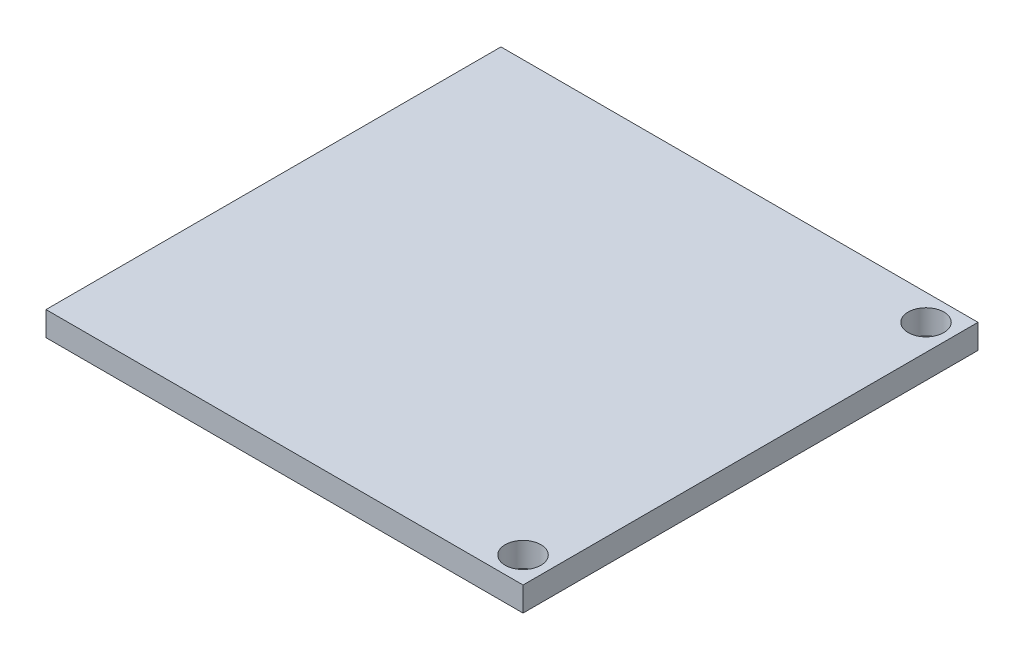
ISO-10303-21;
HEADER;
FILE_DESCRIPTION(('STEP AP214'),'2;1');
FILE_NAME('part.step','',(''),(''),'','','');
FILE_SCHEMA(('AUTOMOTIVE_DESIGN { 1 0 10303 214 1 1 1 1 }'));
ENDSEC;
DATA;
#1=APPLICATION_CONTEXT('core data for automotive mechanical design processes');
#2=APPLICATION_PROTOCOL_DEFINITION('international standard','automotive_design',2000,#1);
#3=PRODUCT_CONTEXT('',#1,'mechanical');
#4=PRODUCT('Part','Part','',(#3));
#5=PRODUCT_RELATED_PRODUCT_CATEGORY('part','',(#4));
#6=PRODUCT_DEFINITION_FORMATION('','',#4);
#7=PRODUCT_DEFINITION_CONTEXT('part definition',#1,'design');
#8=PRODUCT_DEFINITION('design','',#6,#7);
#9=PRODUCT_DEFINITION_SHAPE('','',#8);
#10=(LENGTH_UNIT() NAMED_UNIT(*) SI_UNIT(.MILLI.,.METRE.));
#11=(NAMED_UNIT(*) PLANE_ANGLE_UNIT() SI_UNIT($,.RADIAN.));
#12=(NAMED_UNIT(*) SI_UNIT($,.STERADIAN.) SOLID_ANGLE_UNIT());
#13=UNCERTAINTY_MEASURE_WITH_UNIT(LENGTH_MEASURE(1.E-05),#10,'distance_accuracy_value','');
#14=(GEOMETRIC_REPRESENTATION_CONTEXT(3) GLOBAL_UNCERTAINTY_ASSIGNED_CONTEXT((#13)) GLOBAL_UNIT_ASSIGNED_CONTEXT((#10,
#11,#12)) REPRESENTATION_CONTEXT('',''));
#15=CARTESIAN_POINT('',(0.,0.,0.));
#16=DIRECTION('',(0.,0.,1.));
#17=DIRECTION('',(1.,0.,0.));
#18=AXIS2_PLACEMENT_3D('',#15,#16,#17);
#19=CARTESIAN_POINT('',(0.,1.5,0.));
#20=DIRECTION('',(0.,1.,0.));
#21=DIRECTION('',(0.,0.,1.));
#22=AXIS2_PLACEMENT_3D('',#19,#20,#21);
#23=PLANE('',#22);
#24=CARTESIAN_POINT('',(13.08,1.5,-12.4));
#25=DIRECTION('',(0.,1.,0.));
#26=DIRECTION('',(0.,0.,1.));
#27=AXIS2_PLACEMENT_3D('',#24,#25,#26);
#28=CIRCLE('',#27,1.1);
#29=CARTESIAN_POINT('',(13.08,1.5,-11.3));
#30=VERTEX_POINT('',#29);
#31=EDGE_CURVE('E106',#30,#30,#28,.T.);
#32=ORIENTED_EDGE('',*,*,#31,.F.);
#33=EDGE_LOOP('',(#32));
#34=FACE_BOUND('',#33,.T.);
#35=DIRECTION('',(0.,0.,-1.));
#36=VECTOR('',#35,1.);
#37=CARTESIAN_POINT('',(14.68,1.5,-14.));
#38=LINE('',#37,#36);
#39=CARTESIAN_POINT('',(14.68,1.5,14.));
#40=VERTEX_POINT('',#39);
#41=CARTESIAN_POINT('',(14.68,1.5,-14.));
#42=VERTEX_POINT('',#41);
#43=EDGE_CURVE('E91',#40,#42,#38,.T.);
#44=ORIENTED_EDGE('',*,*,#43,.T.);
#45=DIRECTION('',(-1.,0.,0.));
#46=VECTOR('',#45,1.);
#47=CARTESIAN_POINT('',(-14.68,1.5,-14.));
#48=LINE('',#47,#46);
#49=CARTESIAN_POINT('',(-14.68,1.5,-14.));
#50=VERTEX_POINT('',#49);
#51=EDGE_CURVE('E86',#42,#50,#48,.T.);
#52=ORIENTED_EDGE('',*,*,#51,.T.);
#53=DIRECTION('',(0.,0.,1.));
#54=VECTOR('',#53,1.);
#55=CARTESIAN_POINT('',(-14.68,1.5,-14.));
#56=LINE('',#55,#54);
#57=CARTESIAN_POINT('',(-14.68,1.5,14.));
#58=VERTEX_POINT('',#57);
#59=EDGE_CURVE('E89',#50,#58,#56,.T.);
#60=ORIENTED_EDGE('',*,*,#59,.T.);
#61=DIRECTION('',(1.,0.,0.));
#62=VECTOR('',#61,1.);
#63=CARTESIAN_POINT('',(-14.68,1.5,14.));
#64=LINE('',#63,#62);
#65=EDGE_CURVE('E56',#58,#40,#64,.T.);
#66=ORIENTED_EDGE('',*,*,#65,.T.);
#67=EDGE_LOOP('',(#44,#52,#60,#66));
#68=FACE_BOUND('',#67,.T.);
#69=CARTESIAN_POINT('',(13.08,1.5,12.4));
#70=DIRECTION('',(0.,1.,0.));
#71=DIRECTION('',(0.,0.,1.));
#72=AXIS2_PLACEMENT_3D('',#69,#70,#71);
#73=CIRCLE('',#72,1.1);
#74=CARTESIAN_POINT('',(13.08,1.5,13.5));
#75=VERTEX_POINT('',#74);
#76=EDGE_CURVE('E121',#75,#75,#73,.T.);
#77=ORIENTED_EDGE('',*,*,#76,.F.);
#78=EDGE_LOOP('',(#77));
#79=FACE_BOUND('',#78,.T.);
#80=ADVANCED_FACE('F39',(#34,#68,#79),#23,.T.);
#81=CARTESIAN_POINT('',(0.,0.,0.));
#82=DIRECTION('',(0.,1.,0.));
#83=DIRECTION('',(0.,0.,1.));
#84=AXIS2_PLACEMENT_3D('',#81,#82,#83);
#85=PLANE('',#84);
#86=DIRECTION('',(0.,0.,-1.));
#87=VECTOR('',#86,1.);
#88=CARTESIAN_POINT('',(14.68,0.,-14.));
#89=LINE('',#88,#87);
#90=CARTESIAN_POINT('',(14.68,0.,14.));
#91=VERTEX_POINT('',#90);
#92=CARTESIAN_POINT('',(14.68,0.,-14.));
#93=VERTEX_POINT('',#92);
#94=EDGE_CURVE('E103',#91,#93,#89,.T.);
#95=ORIENTED_EDGE('',*,*,#94,.F.);
#96=DIRECTION('',(1.,0.,0.));
#97=VECTOR('',#96,1.);
#98=CARTESIAN_POINT('',(-14.68,0.,14.));
#99=LINE('',#98,#97);
#100=CARTESIAN_POINT('',(-14.68,0.,14.));
#101=VERTEX_POINT('',#100);
#102=EDGE_CURVE('E79',#101,#91,#99,.T.);
#103=ORIENTED_EDGE('',*,*,#102,.F.);
#104=DIRECTION('',(0.,0.,1.));
#105=VECTOR('',#104,1.);
#106=CARTESIAN_POINT('',(-14.68,0.,-14.));
#107=LINE('',#106,#105);
#108=CARTESIAN_POINT('',(-14.68,0.,-14.));
#109=VERTEX_POINT('',#108);
#110=EDGE_CURVE('E73',#109,#101,#107,.T.);
#111=ORIENTED_EDGE('',*,*,#110,.F.);
#112=DIRECTION('',(-1.,0.,0.));
#113=VECTOR('',#112,1.);
#114=CARTESIAN_POINT('',(-14.68,0.,-14.));
#115=LINE('',#114,#113);
#116=EDGE_CURVE('E95',#93,#109,#115,.T.);
#117=ORIENTED_EDGE('',*,*,#116,.F.);
#118=EDGE_LOOP('',(#95,#103,#111,#117));
#119=FACE_BOUND('',#118,.T.);
#120=CARTESIAN_POINT('',(13.08,0.,-12.4));
#121=DIRECTION('',(0.,1.,0.));
#122=DIRECTION('',(0.,0.,1.));
#123=AXIS2_PLACEMENT_3D('',#120,#121,#122);
#124=CIRCLE('',#123,1.1);
#125=CARTESIAN_POINT('',(13.08,0.,-11.3));
#126=VERTEX_POINT('',#125);
#127=EDGE_CURVE('E118',#126,#126,#124,.T.);
#128=ORIENTED_EDGE('',*,*,#127,.T.);
#129=EDGE_LOOP('',(#128));
#130=FACE_BOUND('',#129,.T.);
#131=CARTESIAN_POINT('',(13.08,0.,12.4));
#132=DIRECTION('',(0.,1.,0.));
#133=DIRECTION('',(0.,0.,1.));
#134=AXIS2_PLACEMENT_3D('',#131,#132,#133);
#135=CIRCLE('',#134,1.1);
#136=CARTESIAN_POINT('',(13.08,0.,13.5));
#137=VERTEX_POINT('',#136);
#138=EDGE_CURVE('E124',#137,#137,#135,.T.);
#139=ORIENTED_EDGE('',*,*,#138,.T.);
#140=EDGE_LOOP('',(#139));
#141=FACE_BOUND('',#140,.T.);
#142=ADVANCED_FACE('F114',(#119,#130,#141),#85,.F.);
#143=CARTESIAN_POINT('',(14.68,1.5,-14.));
#144=DIRECTION('',(-1.,0.,0.));
#145=DIRECTION('',(0.,0.,1.));
#146=AXIS2_PLACEMENT_3D('',#143,#144,#145);
#147=PLANE('',#146);
#148=ORIENTED_EDGE('',*,*,#94,.T.);
#149=DIRECTION('',(0.,-1.,0.));
#150=VECTOR('',#149,1.);
#151=CARTESIAN_POINT('',(14.68,1.5,-14.));
#152=LINE('',#151,#150);
#153=EDGE_CURVE('E11',#42,#93,#152,.T.);
#154=ORIENTED_EDGE('',*,*,#153,.F.);
#155=ORIENTED_EDGE('',*,*,#43,.F.);
#156=DIRECTION('',(0.,-1.,0.));
#157=VECTOR('',#156,1.);
#158=CARTESIAN_POINT('',(14.68,1.5,14.));
#159=LINE('',#158,#157);
#160=EDGE_CURVE('E99',#40,#91,#159,.T.);
#161=ORIENTED_EDGE('',*,*,#160,.T.);
#162=EDGE_LOOP('',(#148,#154,#155,#161));
#163=FACE_BOUND('',#162,.T.);
#164=ADVANCED_FACE('F41',(#163),#147,.F.);
#165=CARTESIAN_POINT('',(-14.68,1.5,-14.));
#166=DIRECTION('',(0.,0.,1.));
#167=DIRECTION('',(1.,0.,0.));
#168=AXIS2_PLACEMENT_3D('',#165,#166,#167);
#169=PLANE('',#168);
#170=ORIENTED_EDGE('',*,*,#116,.T.);
#171=DIRECTION('',(0.,-1.,0.));
#172=VECTOR('',#171,1.);
#173=CARTESIAN_POINT('',(-14.68,1.5,-14.));
#174=LINE('',#173,#172);
#175=EDGE_CURVE('E48',#50,#109,#174,.T.);
#176=ORIENTED_EDGE('',*,*,#175,.F.);
#177=ORIENTED_EDGE('',*,*,#51,.F.);
#178=ORIENTED_EDGE('',*,*,#153,.T.);
#179=EDGE_LOOP('',(#170,#176,#177,#178));
#180=FACE_BOUND('',#179,.T.);
#181=ADVANCED_FACE('F94',(#180),#169,.F.);
#182=CARTESIAN_POINT('',(-14.68,1.5,-14.));
#183=DIRECTION('',(1.,0.,0.));
#184=DIRECTION('',(0.,0.,-1.));
#185=AXIS2_PLACEMENT_3D('',#182,#183,#184);
#186=PLANE('',#185);
#187=ORIENTED_EDGE('',*,*,#110,.T.);
#188=DIRECTION('',(0.,-1.,0.));
#189=VECTOR('',#188,1.);
#190=CARTESIAN_POINT('',(-14.68,1.5,14.));
#191=LINE('',#190,#189);
#192=EDGE_CURVE('E96',#58,#101,#191,.T.);
#193=ORIENTED_EDGE('',*,*,#192,.F.);
#194=ORIENTED_EDGE('',*,*,#59,.F.);
#195=ORIENTED_EDGE('',*,*,#175,.T.);
#196=EDGE_LOOP('',(#187,#193,#194,#195));
#197=FACE_BOUND('',#196,.T.);
#198=ADVANCED_FACE('F97',(#197),#186,.F.);
#199=CARTESIAN_POINT('',(-14.68,1.5,14.));
#200=DIRECTION('',(0.,0.,-1.));
#201=DIRECTION('',(-1.,0.,0.));
#202=AXIS2_PLACEMENT_3D('',#199,#200,#201);
#203=PLANE('',#202);
#204=ORIENTED_EDGE('',*,*,#102,.T.);
#205=ORIENTED_EDGE('',*,*,#160,.F.);
#206=ORIENTED_EDGE('',*,*,#65,.F.);
#207=ORIENTED_EDGE('',*,*,#192,.T.);
#208=EDGE_LOOP('',(#204,#205,#206,#207));
#209=FACE_BOUND('',#208,.T.);
#210=ADVANCED_FACE('F111',(#209),#203,.F.);
#211=CARTESIAN_POINT('',(13.08,1.5,-12.4));
#212=DIRECTION('',(0.,-1.,0.));
#213=DIRECTION('',(0.,0.,-1.));
#214=AXIS2_PLACEMENT_3D('',#211,#212,#213);
#215=CYLINDRICAL_SURFACE('',#214,1.1);
#216=ORIENTED_EDGE('',*,*,#31,.T.);
#217=EDGE_LOOP('',(#216));
#218=FACE_BOUND('',#217,.T.);
#219=ORIENTED_EDGE('',*,*,#127,.F.);
#220=EDGE_LOOP('',(#219));
#221=FACE_BOUND('',#220,.T.);
#222=ADVANCED_FACE('F141',(#218,#221),#215,.F.);
#223=CARTESIAN_POINT('',(13.08,1.5,12.4));
#224=DIRECTION('',(0.,-1.,0.));
#225=DIRECTION('',(0.,0.,-1.));
#226=AXIS2_PLACEMENT_3D('',#223,#224,#225);
#227=CYLINDRICAL_SURFACE('',#226,1.1);
#228=ORIENTED_EDGE('',*,*,#76,.T.);
#229=EDGE_LOOP('',(#228));
#230=FACE_BOUND('',#229,.T.);
#231=ORIENTED_EDGE('',*,*,#138,.F.);
#232=EDGE_LOOP('',(#231));
#233=FACE_BOUND('',#232,.T.);
#234=ADVANCED_FACE('F130',(#230,#233),#227,.F.);
#235=CLOSED_SHELL('',(#80,#142,#164,#181,#198,#210,#222,#234));
#236=MANIFOLD_SOLID_BREP('B2',#235);
#237=ADVANCED_BREP_SHAPE_REPRESENTATION('',(#18,#236),#14);
#238=SHAPE_DEFINITION_REPRESENTATION(#9,#237);
ENDSEC;
END-ISO-10303-21;
